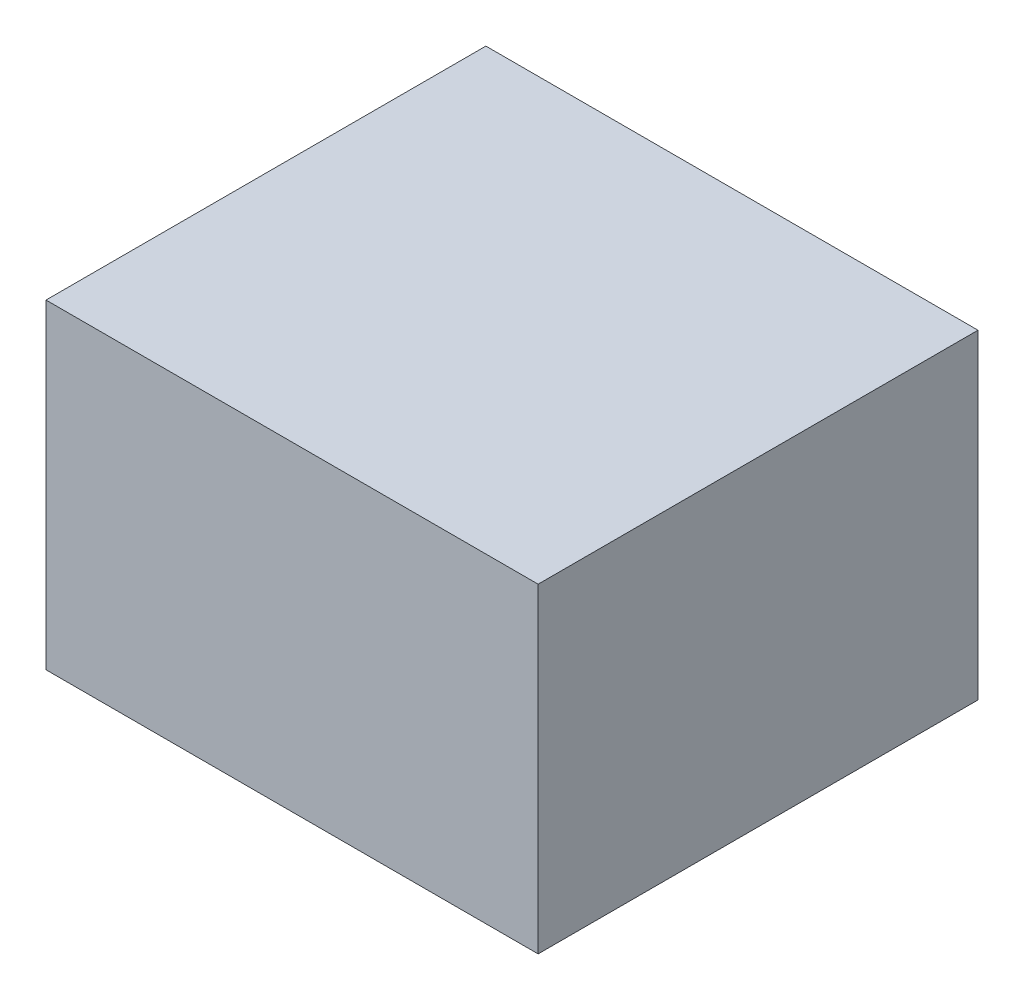
ISO-10303-21;
HEADER;
FILE_DESCRIPTION(('STEP AP214'),'2;1');
FILE_NAME('part.step','',(''),(''),'','','');
FILE_SCHEMA(('AUTOMOTIVE_DESIGN { 1 0 10303 214 1 1 1 1 }'));
ENDSEC;
DATA;
#1=APPLICATION_CONTEXT('core data for automotive mechanical design processes');
#2=APPLICATION_PROTOCOL_DEFINITION('international standard','automotive_design',2000,#1);
#3=PRODUCT_CONTEXT('',#1,'mechanical');
#4=PRODUCT('Part','Part','',(#3));
#5=PRODUCT_RELATED_PRODUCT_CATEGORY('part','',(#4));
#6=PRODUCT_DEFINITION_FORMATION('','',#4);
#7=PRODUCT_DEFINITION_CONTEXT('part definition',#1,'design');
#8=PRODUCT_DEFINITION('design','',#6,#7);
#9=PRODUCT_DEFINITION_SHAPE('','',#8);
#10=(LENGTH_UNIT() NAMED_UNIT(*) SI_UNIT(.MILLI.,.METRE.));
#11=(NAMED_UNIT(*) PLANE_ANGLE_UNIT() SI_UNIT($,.RADIAN.));
#12=(NAMED_UNIT(*) SI_UNIT($,.STERADIAN.) SOLID_ANGLE_UNIT());
#13=UNCERTAINTY_MEASURE_WITH_UNIT(LENGTH_MEASURE(1.E-05),#10,'distance_accuracy_value','');
#14=(GEOMETRIC_REPRESENTATION_CONTEXT(3) GLOBAL_UNCERTAINTY_ASSIGNED_CONTEXT((#13)) GLOBAL_UNIT_ASSIGNED_CONTEXT((#10,
#11,#12)) REPRESENTATION_CONTEXT('',''));
#15=CARTESIAN_POINT('',(0.,0.,0.));
#16=DIRECTION('',(0.,0.,1.));
#17=DIRECTION('',(1.,0.,0.));
#18=AXIS2_PLACEMENT_3D('',#15,#16,#17);
#19=CARTESIAN_POINT('',(146.,95.,130.5));
#20=DIRECTION('',(-1.,0.,0.));
#21=DIRECTION('',(0.,0.,1.));
#22=AXIS2_PLACEMENT_3D('',#19,#20,#21);
#23=PLANE('',#22);
#24=DIRECTION('',(0.,0.,-1.));
#25=VECTOR('',#24,1.);
#26=CARTESIAN_POINT('',(146.,-95.,130.5));
#27=LINE('',#26,#25);
#28=CARTESIAN_POINT('',(146.,-95.,130.5));
#29=VERTEX_POINT('',#28);
#30=CARTESIAN_POINT('',(146.,-95.,-130.5));
#31=VERTEX_POINT('',#30);
#32=EDGE_CURVE('E99',#29,#31,#27,.T.);
#33=ORIENTED_EDGE('',*,*,#32,.T.);
#34=DIRECTION('',(0.,-1.,0.));
#35=VECTOR('',#34,1.);
#36=CARTESIAN_POINT('',(146.,95.,-130.5));
#37=LINE('',#36,#35);
#38=CARTESIAN_POINT('',(146.,95.,-130.5));
#39=VERTEX_POINT('',#38);
#40=EDGE_CURVE('E11',#39,#31,#37,.T.);
#41=ORIENTED_EDGE('',*,*,#40,.F.);
#42=DIRECTION('',(0.,0.,-1.));
#43=VECTOR('',#42,1.);
#44=CARTESIAN_POINT('',(146.,95.,130.5));
#45=LINE('',#44,#43);
#46=CARTESIAN_POINT('',(146.,95.,130.5));
#47=VERTEX_POINT('',#46);
#48=EDGE_CURVE('E87',#47,#39,#45,.T.);
#49=ORIENTED_EDGE('',*,*,#48,.F.);
#50=DIRECTION('',(0.,-1.,0.));
#51=VECTOR('',#50,1.);
#52=CARTESIAN_POINT('',(146.,95.,130.5));
#53=LINE('',#52,#51);
#54=EDGE_CURVE('E95',#47,#29,#53,.T.);
#55=ORIENTED_EDGE('',*,*,#54,.T.);
#56=EDGE_LOOP('',(#33,#41,#49,#55));
#57=FACE_BOUND('',#56,.T.);
#58=ADVANCED_FACE('F36',(#57),#23,.F.);
#59=CARTESIAN_POINT('',(-146.,95.,-130.5));
#60=DIRECTION('',(0.,0.,1.));
#61=DIRECTION('',(1.,0.,0.));
#62=AXIS2_PLACEMENT_3D('',#59,#60,#61);
#63=PLANE('',#62);
#64=DIRECTION('',(-1.,0.,0.));
#65=VECTOR('',#64,1.);
#66=CARTESIAN_POINT('',(-146.,-95.,-130.5));
#67=LINE('',#66,#65);
#68=CARTESIAN_POINT('',(-146.,-95.,-130.5));
#69=VERTEX_POINT('',#68);
#70=EDGE_CURVE('E91',#31,#69,#67,.T.);
#71=ORIENTED_EDGE('',*,*,#70,.T.);
#72=DIRECTION('',(0.,-1.,0.));
#73=VECTOR('',#72,1.);
#74=CARTESIAN_POINT('',(-146.,95.,-130.5));
#75=LINE('',#74,#73);
#76=CARTESIAN_POINT('',(-146.,95.,-130.5));
#77=VERTEX_POINT('',#76);
#78=EDGE_CURVE('E44',#77,#69,#75,.T.);
#79=ORIENTED_EDGE('',*,*,#78,.F.);
#80=DIRECTION('',(-1.,0.,0.));
#81=VECTOR('',#80,1.);
#82=CARTESIAN_POINT('',(-146.,95.,-130.5));
#83=LINE('',#82,#81);
#84=EDGE_CURVE('E82',#39,#77,#83,.T.);
#85=ORIENTED_EDGE('',*,*,#84,.F.);
#86=ORIENTED_EDGE('',*,*,#40,.T.);
#87=EDGE_LOOP('',(#71,#79,#85,#86));
#88=FACE_BOUND('',#87,.T.);
#89=ADVANCED_FACE('F90',(#88),#63,.F.);
#90=CARTESIAN_POINT('',(-146.,95.,130.5));
#91=DIRECTION('',(1.,0.,0.));
#92=DIRECTION('',(0.,0.,-1.));
#93=AXIS2_PLACEMENT_3D('',#90,#91,#92);
#94=PLANE('',#93);
#95=DIRECTION('',(0.,0.,1.));
#96=VECTOR('',#95,1.);
#97=CARTESIAN_POINT('',(-146.,-95.,130.5));
#98=LINE('',#97,#96);
#99=CARTESIAN_POINT('',(-146.,-95.,130.5));
#100=VERTEX_POINT('',#99);
#101=EDGE_CURVE('E69',#69,#100,#98,.T.);
#102=ORIENTED_EDGE('',*,*,#101,.T.);
#103=DIRECTION('',(0.,-1.,0.));
#104=VECTOR('',#103,1.);
#105=CARTESIAN_POINT('',(-146.,95.,130.5));
#106=LINE('',#105,#104);
#107=CARTESIAN_POINT('',(-146.,95.,130.5));
#108=VERTEX_POINT('',#107);
#109=EDGE_CURVE('E92',#108,#100,#106,.T.);
#110=ORIENTED_EDGE('',*,*,#109,.F.);
#111=DIRECTION('',(0.,0.,1.));
#112=VECTOR('',#111,1.);
#113=CARTESIAN_POINT('',(-146.,95.,130.5));
#114=LINE('',#113,#112);
#115=EDGE_CURVE('E85',#77,#108,#114,.T.);
#116=ORIENTED_EDGE('',*,*,#115,.F.);
#117=ORIENTED_EDGE('',*,*,#78,.T.);
#118=EDGE_LOOP('',(#102,#110,#116,#117));
#119=FACE_BOUND('',#118,.T.);
#120=ADVANCED_FACE('F93',(#119),#94,.F.);
#121=CARTESIAN_POINT('',(-146.,95.,130.5));
#122=DIRECTION('',(0.,0.,-1.));
#123=DIRECTION('',(-1.,0.,0.));
#124=AXIS2_PLACEMENT_3D('',#121,#122,#123);
#125=PLANE('',#124);
#126=DIRECTION('',(1.,0.,0.));
#127=VECTOR('',#126,1.);
#128=CARTESIAN_POINT('',(-146.,-95.,130.5));
#129=LINE('',#128,#127);
#130=EDGE_CURVE('E75',#100,#29,#129,.T.);
#131=ORIENTED_EDGE('',*,*,#130,.T.);
#132=ORIENTED_EDGE('',*,*,#54,.F.);
#133=DIRECTION('',(1.,0.,0.));
#134=VECTOR('',#133,1.);
#135=CARTESIAN_POINT('',(-146.,95.,130.5));
#136=LINE('',#135,#134);
#137=EDGE_CURVE('E52',#108,#47,#136,.T.);
#138=ORIENTED_EDGE('',*,*,#137,.F.);
#139=ORIENTED_EDGE('',*,*,#109,.T.);
#140=EDGE_LOOP('',(#131,#132,#138,#139));
#141=FACE_BOUND('',#140,.T.);
#142=ADVANCED_FACE('F106',(#141),#125,.F.);
#143=CARTESIAN_POINT('',(0.,95.,0.));
#144=DIRECTION('',(0.,-1.,0.));
#145=DIRECTION('',(0.,0.,-1.));
#146=AXIS2_PLACEMENT_3D('',#143,#144,#145);
#147=PLANE('',#146);
#148=ORIENTED_EDGE('',*,*,#48,.T.);
#149=ORIENTED_EDGE('',*,*,#84,.T.);
#150=ORIENTED_EDGE('',*,*,#115,.T.);
#151=ORIENTED_EDGE('',*,*,#137,.T.);
#152=EDGE_LOOP('',(#148,#149,#150,#151));
#153=FACE_BOUND('',#152,.T.);
#154=ADVANCED_FACE('F83',(#153),#147,.F.);
#155=CARTESIAN_POINT('',(0.,-95.,0.));
#156=DIRECTION('',(0.,-1.,0.));
#157=DIRECTION('',(0.,0.,-1.));
#158=AXIS2_PLACEMENT_3D('',#155,#156,#157);
#159=PLANE('',#158);
#160=ORIENTED_EDGE('',*,*,#32,.F.);
#161=ORIENTED_EDGE('',*,*,#130,.F.);
#162=ORIENTED_EDGE('',*,*,#101,.F.);
#163=ORIENTED_EDGE('',*,*,#70,.F.);
#164=EDGE_LOOP('',(#160,#161,#162,#163));
#165=FACE_BOUND('',#164,.T.);
#166=ADVANCED_FACE('F109',(#165),#159,.T.);
#167=CLOSED_SHELL('',(#58,#89,#120,#142,#154,#166));
#168=MANIFOLD_SOLID_BREP('B2',#167);
#169=ADVANCED_BREP_SHAPE_REPRESENTATION('',(#18,#168),#14);
#170=SHAPE_DEFINITION_REPRESENTATION(#9,#169);
ENDSEC;
END-ISO-10303-21;
